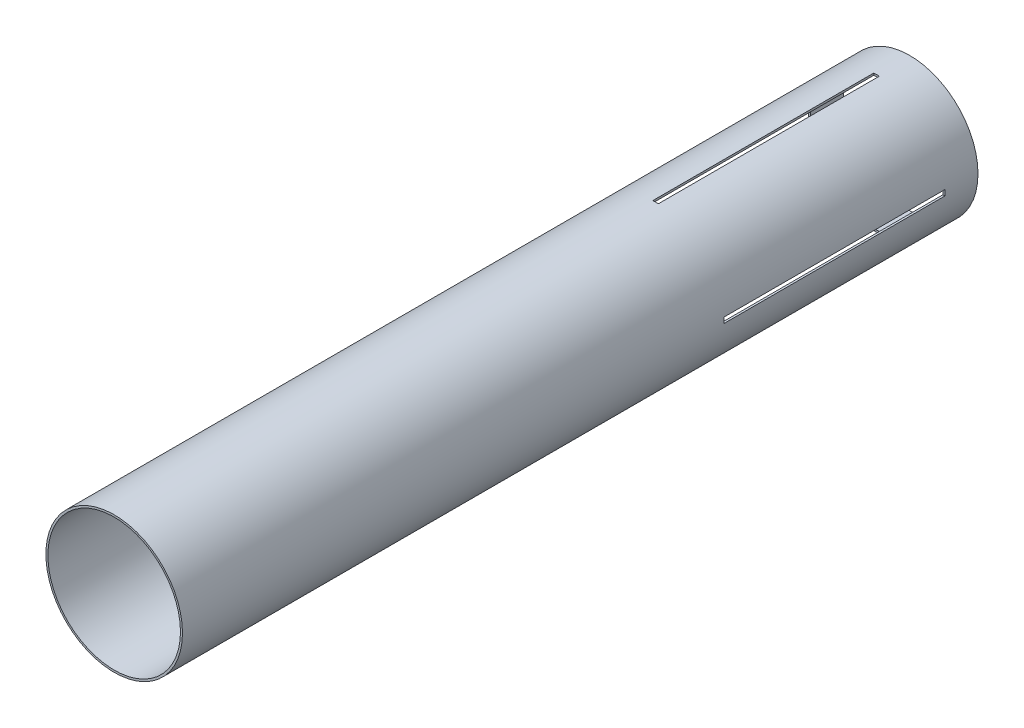
ISO-10303-21;
HEADER;
FILE_DESCRIPTION(('STEP AP214'),'2;1');
FILE_NAME('part.step','',(''),(''),'','','');
FILE_SCHEMA(('AUTOMOTIVE_DESIGN { 1 0 10303 214 1 1 1 1 }'));
ENDSEC;
DATA;
#1=APPLICATION_CONTEXT('core data for automotive mechanical design processes');
#2=APPLICATION_PROTOCOL_DEFINITION('international standard','automotive_design',2000,#1);
#3=PRODUCT_CONTEXT('',#1,'mechanical');
#4=PRODUCT('Part','Part','',(#3));
#5=PRODUCT_RELATED_PRODUCT_CATEGORY('part','',(#4));
#6=PRODUCT_DEFINITION_FORMATION('','',#4);
#7=PRODUCT_DEFINITION_CONTEXT('part definition',#1,'design');
#8=PRODUCT_DEFINITION('design','',#6,#7);
#9=PRODUCT_DEFINITION_SHAPE('','',#8);
#10=(LENGTH_UNIT() NAMED_UNIT(*) SI_UNIT(.MILLI.,.METRE.));
#11=(NAMED_UNIT(*) PLANE_ANGLE_UNIT() SI_UNIT($,.RADIAN.));
#12=(NAMED_UNIT(*) SI_UNIT($,.STERADIAN.) SOLID_ANGLE_UNIT());
#13=UNCERTAINTY_MEASURE_WITH_UNIT(LENGTH_MEASURE(1.E-05),#10,'distance_accuracy_value','');
#14=(GEOMETRIC_REPRESENTATION_CONTEXT(3) GLOBAL_UNCERTAINTY_ASSIGNED_CONTEXT((#13)) GLOBAL_UNIT_ASSIGNED_CONTEXT((#10,
#11,#12)) REPRESENTATION_CONTEXT('',''));
#15=CARTESIAN_POINT('',(0.,0.,0.));
#16=DIRECTION('',(0.,0.,1.));
#17=DIRECTION('',(1.,0.,0.));
#18=AXIS2_PLACEMENT_3D('',#15,#16,#17);
#19=CARTESIAN_POINT('',(0.,0.,228.6));
#20=DIRECTION('',(0.,0.,-1.));
#21=DIRECTION('',(-1.,0.,0.));
#22=AXIS2_PLACEMENT_3D('',#19,#20,#21);
#23=CYLINDRICAL_SURFACE('',#22,39.2557);
#24=CARTESIAN_POINT('',(0.,0.,-82.55));
#25=DIRECTION('',(0.,0.,-1.));
#26=DIRECTION('',(-1.,0.,0.));
#27=AXIS2_PLACEMENT_3D('',#24,#25,#26);
#28=CIRCLE('',#27,39.2557);
#29=CARTESIAN_POINT('',(-39.2235876258152,-1.58750000000014,-82.55));
#30=VERTEX_POINT('',#29);
#31=CARTESIAN_POINT('',(-39.2235876258152,1.58749999999986,-82.55));
#32=VERTEX_POINT('',#31);
#33=EDGE_CURVE('E210',#30,#32,#28,.T.);
#34=ORIENTED_EDGE('',*,*,#33,.F.);
#35=DIRECTION('',(0.,0.,-1.));
#36=VECTOR('',#35,1.);
#37=CARTESIAN_POINT('',(-39.2235876258152,-1.58750000000014,228.6));
#38=LINE('',#37,#36);
#39=CARTESIAN_POINT('',(-39.2235876258152,-1.58750000000014,-209.55));
#40=VERTEX_POINT('',#39);
#41=EDGE_CURVE('E233',#40,#30,#38,.F.);
#42=ORIENTED_EDGE('',*,*,#41,.F.);
#43=CARTESIAN_POINT('',(0.,0.,-209.55));
#44=DIRECTION('',(0.,0.,1.));
#45=DIRECTION('',(1.,0.,0.));
#46=AXIS2_PLACEMENT_3D('',#43,#44,#45);
#47=CIRCLE('',#46,39.2557);
#48=CARTESIAN_POINT('',(-39.2235876258152,1.58749999999986,-209.55));
#49=VERTEX_POINT('',#48);
#50=EDGE_CURVE('E226',#49,#40,#47,.T.);
#51=ORIENTED_EDGE('',*,*,#50,.F.);
#52=DIRECTION('',(0.,0.,-1.));
#53=VECTOR('',#52,1.);
#54=CARTESIAN_POINT('',(-39.2235876258152,1.58749999999986,228.6));
#55=LINE('',#54,#53);
#56=EDGE_CURVE('E230',#32,#49,#55,.T.);
#57=ORIENTED_EDGE('',*,*,#56,.F.);
#58=EDGE_LOOP('',(#34,#42,#51,#57));
#59=FACE_BOUND('',#58,.T.);
#60=CARTESIAN_POINT('',(1.5875,-39.2235876258152,-82.55));
#61=VERTEX_POINT('',#60);
#62=CARTESIAN_POINT('',(-1.5875,-39.2235876258152,-82.55));
#63=VERTEX_POINT('',#62);
#64=EDGE_CURVE('E234',#61,#63,#28,.T.);
#65=ORIENTED_EDGE('',*,*,#64,.F.);
#66=DIRECTION('',(0.,0.,-1.));
#67=VECTOR('',#66,1.);
#68=CARTESIAN_POINT('',(1.5875,-39.2235876258152,228.6));
#69=LINE('',#68,#67);
#70=CARTESIAN_POINT('',(1.5875,-39.2235876258152,-209.55));
#71=VERTEX_POINT('',#70);
#72=EDGE_CURVE('E221',#71,#61,#69,.F.);
#73=ORIENTED_EDGE('',*,*,#72,.F.);
#74=CARTESIAN_POINT('',(-1.5875,-39.2235876258152,-209.55));
#75=VERTEX_POINT('',#74);
#76=EDGE_CURVE('E53',#75,#71,#47,.T.);
#77=ORIENTED_EDGE('',*,*,#76,.F.);
#78=DIRECTION('',(0.,0.,-1.));
#79=VECTOR('',#78,1.);
#80=CARTESIAN_POINT('',(-1.5875,-39.2235876258152,228.6));
#81=LINE('',#80,#79);
#82=EDGE_CURVE('E223',#63,#75,#81,.T.);
#83=ORIENTED_EDGE('',*,*,#82,.F.);
#84=EDGE_LOOP('',(#65,#73,#77,#83));
#85=FACE_BOUND('',#84,.T.);
#86=CARTESIAN_POINT('',(0.,0.,228.6));
#87=DIRECTION('',(0.,0.,1.));
#88=DIRECTION('',(1.,0.,0.));
#89=AXIS2_PLACEMENT_3D('',#86,#87,#88);
#90=CIRCLE('',#89,39.2557);
#91=CARTESIAN_POINT('',(39.2557,0.,228.6));
#92=VERTEX_POINT('',#91);
#93=EDGE_CURVE('E263',#92,#92,#90,.T.);
#94=ORIENTED_EDGE('',*,*,#93,.F.);
#95=EDGE_LOOP('',(#94));
#96=FACE_BOUND('',#95,.T.);
#97=CARTESIAN_POINT('',(0.,0.,-228.6));
#98=DIRECTION('',(0.,0.,1.));
#99=DIRECTION('',(1.,0.,0.));
#100=AXIS2_PLACEMENT_3D('',#97,#98,#99);
#101=CIRCLE('',#100,39.2557);
#102=CARTESIAN_POINT('',(39.2557,0.,-228.6));
#103=VERTEX_POINT('',#102);
#104=EDGE_CURVE('E260',#103,#103,#101,.T.);
#105=ORIENTED_EDGE('',*,*,#104,.T.);
#106=EDGE_LOOP('',(#105));
#107=FACE_BOUND('',#106,.T.);
#108=CARTESIAN_POINT('',(0.,0.,-209.55));
#109=DIRECTION('',(0.,0.,1.));
#110=DIRECTION('',(1.,0.,0.));
#111=AXIS2_PLACEMENT_3D('',#108,#109,#110);
#112=CIRCLE('',#111,39.2557);
#113=CARTESIAN_POINT('',(1.5875,39.2235876258152,-209.55));
#114=VERTEX_POINT('',#113);
#115=CARTESIAN_POINT('',(-1.5875,39.2235876258152,-209.55));
#116=VERTEX_POINT('',#115);
#117=EDGE_CURVE('E248',#114,#116,#112,.T.);
#118=ORIENTED_EDGE('',*,*,#117,.F.);
#119=DIRECTION('',(0.,0.,-1.));
#120=VECTOR('',#119,1.);
#121=CARTESIAN_POINT('',(1.5875,39.2235876258152,228.6));
#122=LINE('',#121,#120);
#123=CARTESIAN_POINT('',(1.5875,39.2235876258152,-82.55));
#124=VERTEX_POINT('',#123);
#125=EDGE_CURVE('E250',#124,#114,#122,.T.);
#126=ORIENTED_EDGE('',*,*,#125,.F.);
#127=CARTESIAN_POINT('',(0.,0.,-82.55));
#128=DIRECTION('',(0.,0.,-1.));
#129=DIRECTION('',(-1.,0.,0.));
#130=AXIS2_PLACEMENT_3D('',#127,#128,#129);
#131=CIRCLE('',#130,39.2557);
#132=CARTESIAN_POINT('',(-1.5875,39.2235876258152,-82.55));
#133=VERTEX_POINT('',#132);
#134=EDGE_CURVE('E252',#133,#124,#131,.T.);
#135=ORIENTED_EDGE('',*,*,#134,.F.);
#136=DIRECTION('',(0.,0.,-1.));
#137=VECTOR('',#136,1.);
#138=CARTESIAN_POINT('',(-1.5875,39.2235876258152,228.6));
#139=LINE('',#138,#137);
#140=EDGE_CURVE('E254',#116,#133,#139,.F.);
#141=ORIENTED_EDGE('',*,*,#140,.F.);
#142=EDGE_LOOP('',(#118,#126,#135,#141));
#143=FACE_BOUND('',#142,.T.);
#144=CARTESIAN_POINT('',(39.2235876258151,1.58750000000014,-82.55));
#145=VERTEX_POINT('',#144);
#146=CARTESIAN_POINT('',(39.2235876258152,-1.58749999999959,-82.55));
#147=VERTEX_POINT('',#146);
#148=EDGE_CURVE('E61',#145,#147,#28,.T.);
#149=ORIENTED_EDGE('',*,*,#148,.F.);
#150=DIRECTION('',(0.,0.,-1.));
#151=VECTOR('',#150,1.);
#152=CARTESIAN_POINT('',(39.2235876258152,1.58750000000014,228.6));
#153=LINE('',#152,#151);
#154=CARTESIAN_POINT('',(39.2235876258152,1.58750000000014,-209.55));
#155=VERTEX_POINT('',#154);
#156=EDGE_CURVE('E228',#155,#145,#153,.F.);
#157=ORIENTED_EDGE('',*,*,#156,.F.);
#158=CARTESIAN_POINT('',(39.2235876258152,-1.58749999999959,-209.55));
#159=VERTEX_POINT('',#158);
#160=EDGE_CURVE('E225',#159,#155,#47,.T.);
#161=ORIENTED_EDGE('',*,*,#160,.F.);
#162=DIRECTION('',(0.,0.,-1.));
#163=VECTOR('',#162,1.);
#164=CARTESIAN_POINT('',(39.2235876258152,-1.58749999999959,228.6));
#165=LINE('',#164,#163);
#166=EDGE_CURVE('E214',#147,#159,#165,.T.);
#167=ORIENTED_EDGE('',*,*,#166,.F.);
#168=EDGE_LOOP('',(#149,#157,#161,#167));
#169=FACE_BOUND('',#168,.T.);
#170=ADVANCED_FACE('F39',(#59,#85,#96,#107,#143,#169),#23,.T.);
#171=CARTESIAN_POINT('',(0.,0.,228.6));
#172=DIRECTION('',(0.,0.,-1.));
#173=DIRECTION('',(-1.,0.,0.));
#174=AXIS2_PLACEMENT_3D('',#171,#172,#173);
#175=CYLINDRICAL_SURFACE('',#174,38.1);
#176=CARTESIAN_POINT('',(0.,0.,228.6));
#177=DIRECTION('',(0.,0.,1.));
#178=DIRECTION('',(1.,0.,0.));
#179=AXIS2_PLACEMENT_3D('',#176,#177,#178);
#180=CIRCLE('',#179,38.1);
#181=CARTESIAN_POINT('',(38.1,0.,228.6));
#182=VERTEX_POINT('',#181);
#183=EDGE_CURVE('E257',#182,#182,#180,.T.);
#184=ORIENTED_EDGE('',*,*,#183,.T.);
#185=EDGE_LOOP('',(#184));
#186=FACE_BOUND('',#185,.T.);
#187=CARTESIAN_POINT('',(0.,0.,-228.6));
#188=DIRECTION('',(0.,0.,1.));
#189=DIRECTION('',(1.,0.,0.));
#190=AXIS2_PLACEMENT_3D('',#187,#188,#189);
#191=CIRCLE('',#190,38.1);
#192=CARTESIAN_POINT('',(38.1,0.,-228.6));
#193=VERTEX_POINT('',#192);
#194=EDGE_CURVE('E256',#193,#193,#191,.T.);
#195=ORIENTED_EDGE('',*,*,#194,.F.);
#196=EDGE_LOOP('',(#195));
#197=FACE_BOUND('',#196,.T.);
#198=CARTESIAN_POINT('',(0.,0.,-209.55));
#199=DIRECTION('',(0.,0.,1.));
#200=DIRECTION('',(1.,0.,0.));
#201=AXIS2_PLACEMENT_3D('',#198,#199,#200);
#202=CIRCLE('',#201,38.1);
#203=CARTESIAN_POINT('',(1.5875,38.0669127162947,-209.55));
#204=VERTEX_POINT('',#203);
#205=CARTESIAN_POINT('',(-1.5875,38.0669127162947,-209.55));
#206=VERTEX_POINT('',#205);
#207=EDGE_CURVE('E266',#204,#206,#202,.T.);
#208=ORIENTED_EDGE('',*,*,#207,.T.);
#209=DIRECTION('',(0.,0.,-1.));
#210=VECTOR('',#209,1.);
#211=CARTESIAN_POINT('',(-1.5875,38.0669127162947,228.6));
#212=LINE('',#211,#210);
#213=CARTESIAN_POINT('',(-1.5875,38.0669127162947,-82.55));
#214=VERTEX_POINT('',#213);
#215=EDGE_CURVE('E166',#206,#214,#212,.F.);
#216=ORIENTED_EDGE('',*,*,#215,.T.);
#217=CARTESIAN_POINT('',(0.,0.,-82.55));
#218=DIRECTION('',(0.,0.,-1.));
#219=DIRECTION('',(-1.,0.,0.));
#220=AXIS2_PLACEMENT_3D('',#217,#218,#219);
#221=CIRCLE('',#220,38.1);
#222=CARTESIAN_POINT('',(1.5875,38.0669127162947,-82.55));
#223=VERTEX_POINT('',#222);
#224=EDGE_CURVE('E274',#214,#223,#221,.T.);
#225=ORIENTED_EDGE('',*,*,#224,.T.);
#226=DIRECTION('',(0.,0.,-1.));
#227=VECTOR('',#226,1.);
#228=CARTESIAN_POINT('',(1.5875,38.0669127162947,228.6));
#229=LINE('',#228,#227);
#230=EDGE_CURVE('E271',#223,#204,#229,.T.);
#231=ORIENTED_EDGE('',*,*,#230,.T.);
#232=EDGE_LOOP('',(#208,#216,#225,#231));
#233=FACE_BOUND('',#232,.T.);
#234=DIRECTION('',(0.,0.,-1.));
#235=VECTOR('',#234,1.);
#236=CARTESIAN_POINT('',(38.0669127162947,1.58750000000013,228.6));
#237=LINE('',#236,#235);
#238=CARTESIAN_POINT('',(38.0669127162947,1.58750000000013,-209.55));
#239=VERTEX_POINT('',#238);
#240=CARTESIAN_POINT('',(38.0669127162947,1.58750000000013,-82.55));
#241=VERTEX_POINT('',#240);
#242=EDGE_CURVE('E176',#239,#241,#237,.F.);
#243=ORIENTED_EDGE('',*,*,#242,.T.);
#244=CARTESIAN_POINT('',(0.,0.,-82.55));
#245=DIRECTION('',(0.,0.,-1.));
#246=DIRECTION('',(-1.,0.,0.));
#247=AXIS2_PLACEMENT_3D('',#244,#245,#246);
#248=CIRCLE('',#247,38.1);
#249=CARTESIAN_POINT('',(38.0669127162947,-1.5874999999996,-82.55));
#250=VERTEX_POINT('',#249);
#251=EDGE_CURVE('E169',#241,#250,#248,.T.);
#252=ORIENTED_EDGE('',*,*,#251,.T.);
#253=DIRECTION('',(0.,0.,-1.));
#254=VECTOR('',#253,1.);
#255=CARTESIAN_POINT('',(38.0669127162947,-1.5874999999996,228.6));
#256=LINE('',#255,#254);
#257=CARTESIAN_POINT('',(38.0669127162947,-1.5874999999996,-209.55));
#258=VERTEX_POINT('',#257);
#259=EDGE_CURVE('E154',#250,#258,#256,.T.);
#260=ORIENTED_EDGE('',*,*,#259,.T.);
#261=CARTESIAN_POINT('',(0.,0.,-209.55));
#262=DIRECTION('',(0.,0.,1.));
#263=DIRECTION('',(1.,0.,0.));
#264=AXIS2_PLACEMENT_3D('',#261,#262,#263);
#265=CIRCLE('',#264,38.1);
#266=EDGE_CURVE('E165',#258,#239,#265,.T.);
#267=ORIENTED_EDGE('',*,*,#266,.T.);
#268=EDGE_LOOP('',(#243,#252,#260,#267));
#269=FACE_BOUND('',#268,.T.);
#270=CARTESIAN_POINT('',(1.5875,-38.0669127162947,-82.55));
#271=VERTEX_POINT('',#270);
#272=CARTESIAN_POINT('',(-1.5875,-38.0669127162947,-82.55));
#273=VERTEX_POINT('',#272);
#274=EDGE_CURVE('E179',#271,#273,#248,.T.);
#275=ORIENTED_EDGE('',*,*,#274,.T.);
#276=DIRECTION('',(0.,0.,-1.));
#277=VECTOR('',#276,1.);
#278=CARTESIAN_POINT('',(-1.5875,-38.0669127162947,228.6));
#279=LINE('',#278,#277);
#280=CARTESIAN_POINT('',(-1.5875,-38.0669127162947,-209.55));
#281=VERTEX_POINT('',#280);
#282=EDGE_CURVE('E187',#273,#281,#279,.T.);
#283=ORIENTED_EDGE('',*,*,#282,.T.);
#284=CARTESIAN_POINT('',(1.5875,-38.0669127162947,-209.55));
#285=VERTEX_POINT('',#284);
#286=EDGE_CURVE('E181',#281,#285,#265,.T.);
#287=ORIENTED_EDGE('',*,*,#286,.T.);
#288=DIRECTION('',(0.,0.,-1.));
#289=VECTOR('',#288,1.);
#290=CARTESIAN_POINT('',(1.5875,-38.0669127162947,228.6));
#291=LINE('',#290,#289);
#292=EDGE_CURVE('E177',#285,#271,#291,.F.);
#293=ORIENTED_EDGE('',*,*,#292,.T.);
#294=EDGE_LOOP('',(#275,#283,#287,#293));
#295=FACE_BOUND('',#294,.T.);
#296=CARTESIAN_POINT('',(-38.0669127162947,1.58749999999987,-209.55));
#297=VERTEX_POINT('',#296);
#298=CARTESIAN_POINT('',(-38.0669127162947,-1.58750000000013,-209.55));
#299=VERTEX_POINT('',#298);
#300=EDGE_CURVE('E190',#297,#299,#265,.T.);
#301=ORIENTED_EDGE('',*,*,#300,.T.);
#302=DIRECTION('',(0.,0.,-1.));
#303=VECTOR('',#302,1.);
#304=CARTESIAN_POINT('',(-38.0669127162947,-1.58750000000013,228.6));
#305=LINE('',#304,#303);
#306=CARTESIAN_POINT('',(-38.0669127162947,-1.58750000000013,-82.55));
#307=VERTEX_POINT('',#306);
#308=EDGE_CURVE('E11',#299,#307,#305,.F.);
#309=ORIENTED_EDGE('',*,*,#308,.T.);
#310=CARTESIAN_POINT('',(-38.0669127162947,1.58749999999987,-82.55));
#311=VERTEX_POINT('',#310);
#312=EDGE_CURVE('E46',#307,#311,#248,.T.);
#313=ORIENTED_EDGE('',*,*,#312,.T.);
#314=DIRECTION('',(0.,0.,-1.));
#315=VECTOR('',#314,1.);
#316=CARTESIAN_POINT('',(-38.0669127162947,1.58749999999987,228.6));
#317=LINE('',#316,#315);
#318=EDGE_CURVE('E185',#311,#297,#317,.T.);
#319=ORIENTED_EDGE('',*,*,#318,.T.);
#320=EDGE_LOOP('',(#301,#309,#313,#319));
#321=FACE_BOUND('',#320,.T.);
#322=ADVANCED_FACE('F174',(#186,#197,#233,#269,#295,#321),#175,.F.);
#323=CARTESIAN_POINT('',(0.,0.,228.6));
#324=DIRECTION('',(0.,0.,1.));
#325=DIRECTION('',(1.,0.,0.));
#326=AXIS2_PLACEMENT_3D('',#323,#324,#325);
#327=PLANE('',#326);
#328=ORIENTED_EDGE('',*,*,#93,.T.);
#329=EDGE_LOOP('',(#328));
#330=FACE_BOUND('',#329,.T.);
#331=ORIENTED_EDGE('',*,*,#183,.F.);
#332=EDGE_LOOP('',(#331));
#333=FACE_BOUND('',#332,.T.);
#334=ADVANCED_FACE('F313',(#330,#333),#327,.T.);
#335=CARTESIAN_POINT('',(0.,0.,-228.6));
#336=DIRECTION('',(0.,0.,1.));
#337=DIRECTION('',(1.,0.,0.));
#338=AXIS2_PLACEMENT_3D('',#335,#336,#337);
#339=PLANE('',#338);
#340=ORIENTED_EDGE('',*,*,#104,.F.);
#341=EDGE_LOOP('',(#340));
#342=FACE_BOUND('',#341,.T.);
#343=ORIENTED_EDGE('',*,*,#194,.T.);
#344=EDGE_LOOP('',(#343));
#345=FACE_BOUND('',#344,.T.);
#346=ADVANCED_FACE('F326',(#342,#345),#339,.F.);
#347=CARTESIAN_POINT('',(-1.5875,39.2557,-82.55));
#348=DIRECTION('',(1.,0.,0.));
#349=DIRECTION('',(0.,0.,-1.));
#350=AXIS2_PLACEMENT_3D('',#347,#348,#349);
#351=PLANE('',#350);
#352=ORIENTED_EDGE('',*,*,#140,.T.);
#353=DIRECTION('',(0.,-1.,0.));
#354=VECTOR('',#353,1.);
#355=CARTESIAN_POINT('',(-1.5875,39.2557,-82.55));
#356=LINE('',#355,#354);
#357=EDGE_CURVE('E245',#133,#214,#356,.T.);
#358=ORIENTED_EDGE('',*,*,#357,.T.);
#359=ORIENTED_EDGE('',*,*,#215,.F.);
#360=DIRECTION('',(0.,-1.,0.));
#361=VECTOR('',#360,1.);
#362=CARTESIAN_POINT('',(-1.5875,39.2557,-209.55));
#363=LINE('',#362,#361);
#364=EDGE_CURVE('E237',#116,#206,#363,.T.);
#365=ORIENTED_EDGE('',*,*,#364,.F.);
#366=EDGE_LOOP('',(#352,#358,#359,#365));
#367=FACE_BOUND('',#366,.T.);
#368=ADVANCED_FACE('F282',(#367),#351,.T.);
#369=CARTESIAN_POINT('',(1.5875,39.2557,-82.55));
#370=DIRECTION('',(0.,0.,-1.));
#371=DIRECTION('',(-1.,0.,0.));
#372=AXIS2_PLACEMENT_3D('',#369,#370,#371);
#373=PLANE('',#372);
#374=ORIENTED_EDGE('',*,*,#134,.T.);
#375=DIRECTION('',(0.,-1.,0.));
#376=VECTOR('',#375,1.);
#377=CARTESIAN_POINT('',(1.5875,39.2557,-82.55));
#378=LINE('',#377,#376);
#379=EDGE_CURVE('E242',#124,#223,#378,.T.);
#380=ORIENTED_EDGE('',*,*,#379,.T.);
#381=ORIENTED_EDGE('',*,*,#224,.F.);
#382=ORIENTED_EDGE('',*,*,#357,.F.);
#383=EDGE_LOOP('',(#374,#380,#381,#382));
#384=FACE_BOUND('',#383,.T.);
#385=ADVANCED_FACE('F287',(#384),#373,.T.);
#386=CARTESIAN_POINT('',(1.5875,39.2557,-82.55));
#387=DIRECTION('',(-1.,0.,0.));
#388=DIRECTION('',(0.,0.,1.));
#389=AXIS2_PLACEMENT_3D('',#386,#387,#388);
#390=PLANE('',#389);
#391=ORIENTED_EDGE('',*,*,#125,.T.);
#392=DIRECTION('',(0.,-1.,0.));
#393=VECTOR('',#392,1.);
#394=CARTESIAN_POINT('',(1.5875,39.2557,-209.55));
#395=LINE('',#394,#393);
#396=EDGE_CURVE('E239',#114,#204,#395,.T.);
#397=ORIENTED_EDGE('',*,*,#396,.T.);
#398=ORIENTED_EDGE('',*,*,#230,.F.);
#399=ORIENTED_EDGE('',*,*,#379,.F.);
#400=EDGE_LOOP('',(#391,#397,#398,#399));
#401=FACE_BOUND('',#400,.T.);
#402=ADVANCED_FACE('F295',(#401),#390,.T.);
#403=CARTESIAN_POINT('',(1.5875,39.2557,-209.55));
#404=DIRECTION('',(0.,0.,1.));
#405=DIRECTION('',(1.,0.,0.));
#406=AXIS2_PLACEMENT_3D('',#403,#404,#405);
#407=PLANE('',#406);
#408=ORIENTED_EDGE('',*,*,#117,.T.);
#409=ORIENTED_EDGE('',*,*,#364,.T.);
#410=ORIENTED_EDGE('',*,*,#207,.F.);
#411=ORIENTED_EDGE('',*,*,#396,.F.);
#412=EDGE_LOOP('',(#408,#409,#410,#411));
#413=FACE_BOUND('',#412,.T.);
#414=ADVANCED_FACE('F297',(#413),#407,.T.);
#415=CARTESIAN_POINT('',(39.2557000000004,-1.58749999999959,-82.55));
#416=DIRECTION('',(0.,1.,0.));
#417=DIRECTION('',(-1.,0.,0.));
#418=AXIS2_PLACEMENT_3D('',#415,#416,#417);
#419=PLANE('',#418);
#420=ORIENTED_EDGE('',*,*,#166,.T.);
#421=DIRECTION('',(-1.,0.,0.));
#422=VECTOR('',#421,1.);
#423=CARTESIAN_POINT('',(39.2557000000004,-1.58749999999959,-209.55));
#424=LINE('',#423,#422);
#425=EDGE_CURVE('E160',#159,#258,#424,.T.);
#426=ORIENTED_EDGE('',*,*,#425,.T.);
#427=ORIENTED_EDGE('',*,*,#259,.F.);
#428=DIRECTION('',(-1.,0.,0.));
#429=VECTOR('',#428,1.);
#430=CARTESIAN_POINT('',(39.2557000000004,-1.58749999999959,-82.55));
#431=LINE('',#430,#429);
#432=EDGE_CURVE('E157',#147,#250,#431,.T.);
#433=ORIENTED_EDGE('',*,*,#432,.F.);
#434=EDGE_LOOP('',(#420,#426,#427,#433));
#435=FACE_BOUND('',#434,.T.);
#436=ADVANCED_FACE('F156',(#435),#419,.T.);
#437=CARTESIAN_POINT('',(-39.2557000000002,1.58749999999986,-209.55));
#438=DIRECTION('',(0.,0.,1.));
#439=DIRECTION('',(1.,0.,0.));
#440=AXIS2_PLACEMENT_3D('',#437,#438,#439);
#441=PLANE('',#440);
#442=ORIENTED_EDGE('',*,*,#160,.T.);
#443=DIRECTION('',(1.,0.,0.));
#444=VECTOR('',#443,1.);
#445=CARTESIAN_POINT('',(-39.2557000000002,1.58749999999986,-209.55));
#446=LINE('',#445,#444);
#447=EDGE_CURVE('E217',#239,#155,#446,.T.);
#448=ORIENTED_EDGE('',*,*,#447,.F.);
#449=ORIENTED_EDGE('',*,*,#266,.F.);
#450=ORIENTED_EDGE('',*,*,#425,.F.);
#451=EDGE_LOOP('',(#442,#448,#449,#450));
#452=FACE_BOUND('',#451,.T.);
#453=ADVANCED_FACE('F305',(#452),#441,.T.);
#454=CARTESIAN_POINT('',(-39.2557000000002,1.58749999999986,-82.55));
#455=DIRECTION('',(0.,-1.,0.));
#456=DIRECTION('',(1.,0.,0.));
#457=AXIS2_PLACEMENT_3D('',#454,#455,#456);
#458=PLANE('',#457);
#459=ORIENTED_EDGE('',*,*,#156,.T.);
#460=DIRECTION('',(1.,0.,0.));
#461=VECTOR('',#460,1.);
#462=CARTESIAN_POINT('',(-39.2557000000002,1.58749999999986,-82.55));
#463=LINE('',#462,#461);
#464=EDGE_CURVE('E212',#241,#145,#463,.T.);
#465=ORIENTED_EDGE('',*,*,#464,.F.);
#466=ORIENTED_EDGE('',*,*,#242,.F.);
#467=ORIENTED_EDGE('',*,*,#447,.T.);
#468=EDGE_LOOP('',(#459,#465,#466,#467));
#469=FACE_BOUND('',#468,.T.);
#470=ADVANCED_FACE('F379',(#469),#458,.T.);
#471=CARTESIAN_POINT('',(-39.2557000000002,1.58749999999986,-82.55));
#472=DIRECTION('',(0.,0.,-1.));
#473=DIRECTION('',(-1.,0.,0.));
#474=AXIS2_PLACEMENT_3D('',#471,#472,#473);
#475=PLANE('',#474);
#476=ORIENTED_EDGE('',*,*,#148,.T.);
#477=ORIENTED_EDGE('',*,*,#432,.T.);
#478=ORIENTED_EDGE('',*,*,#251,.F.);
#479=ORIENTED_EDGE('',*,*,#464,.T.);
#480=EDGE_LOOP('',(#476,#477,#478,#479));
#481=FACE_BOUND('',#480,.T.);
#482=ADVANCED_FACE('F168',(#481),#475,.T.);
#483=CARTESIAN_POINT('',(1.5875,-39.2557,-82.55));
#484=DIRECTION('',(-1.,0.,0.));
#485=DIRECTION('',(0.,0.,1.));
#486=AXIS2_PLACEMENT_3D('',#483,#484,#485);
#487=PLANE('',#486);
#488=ORIENTED_EDGE('',*,*,#72,.T.);
#489=DIRECTION('',(0.,1.,0.));
#490=VECTOR('',#489,1.);
#491=CARTESIAN_POINT('',(1.5875,-39.2557,-82.55));
#492=LINE('',#491,#490);
#493=EDGE_CURVE('E515',#61,#271,#492,.T.);
#494=ORIENTED_EDGE('',*,*,#493,.T.);
#495=ORIENTED_EDGE('',*,*,#292,.F.);
#496=DIRECTION('',(0.,1.,0.));
#497=VECTOR('',#496,1.);
#498=CARTESIAN_POINT('',(1.5875,-39.2557,-209.55));
#499=LINE('',#498,#497);
#500=EDGE_CURVE('E171',#71,#285,#499,.T.);
#501=ORIENTED_EDGE('',*,*,#500,.F.);
#502=EDGE_LOOP('',(#488,#494,#495,#501));
#503=FACE_BOUND('',#502,.T.);
#504=ADVANCED_FACE('F409',(#503),#487,.T.);
#505=CARTESIAN_POINT('',(-1.5875,-39.2557,-82.55));
#506=DIRECTION('',(1.,0.,0.));
#507=DIRECTION('',(0.,0.,-1.));
#508=AXIS2_PLACEMENT_3D('',#505,#506,#507);
#509=PLANE('',#508);
#510=ORIENTED_EDGE('',*,*,#82,.T.);
#511=DIRECTION('',(0.,1.,0.));
#512=VECTOR('',#511,1.);
#513=CARTESIAN_POINT('',(-1.5875,-39.2557,-209.55));
#514=LINE('',#513,#512);
#515=EDGE_CURVE('E522',#75,#281,#514,.T.);
#516=ORIENTED_EDGE('',*,*,#515,.T.);
#517=ORIENTED_EDGE('',*,*,#282,.F.);
#518=DIRECTION('',(0.,1.,0.));
#519=VECTOR('',#518,1.);
#520=CARTESIAN_POINT('',(-1.5875,-39.2557,-82.55));
#521=LINE('',#520,#519);
#522=EDGE_CURVE('E517',#63,#273,#521,.T.);
#523=ORIENTED_EDGE('',*,*,#522,.F.);
#524=EDGE_LOOP('',(#510,#516,#517,#523));
#525=FACE_BOUND('',#524,.T.);
#526=ADVANCED_FACE('F425',(#525),#509,.T.);
#527=ORIENTED_EDGE('',*,*,#76,.T.);
#528=ORIENTED_EDGE('',*,*,#500,.T.);
#529=ORIENTED_EDGE('',*,*,#286,.F.);
#530=ORIENTED_EDGE('',*,*,#515,.F.);
#531=EDGE_LOOP('',(#527,#528,#529,#530));
#532=FACE_BOUND('',#531,.T.);
#533=ADVANCED_FACE('F383',(#532),#441,.T.);
#534=ORIENTED_EDGE('',*,*,#64,.T.);
#535=ORIENTED_EDGE('',*,*,#522,.T.);
#536=ORIENTED_EDGE('',*,*,#274,.F.);
#537=ORIENTED_EDGE('',*,*,#493,.F.);
#538=EDGE_LOOP('',(#534,#535,#536,#537));
#539=FACE_BOUND('',#538,.T.);
#540=ADVANCED_FACE('F411',(#539),#475,.T.);
#541=CARTESIAN_POINT('',(-39.2557000000001,-1.58750000000014,-82.55));
#542=DIRECTION('',(0.,1.,0.));
#543=DIRECTION('',(-1.,0.,0.));
#544=AXIS2_PLACEMENT_3D('',#541,#542,#543);
#545=PLANE('',#544);
#546=ORIENTED_EDGE('',*,*,#41,.T.);
#547=DIRECTION('',(1.,0.,0.));
#548=VECTOR('',#547,1.);
#549=CARTESIAN_POINT('',(-39.2557000000001,-1.58750000000014,-82.55));
#550=LINE('',#549,#548);
#551=EDGE_CURVE('E211',#30,#307,#550,.T.);
#552=ORIENTED_EDGE('',*,*,#551,.T.);
#553=ORIENTED_EDGE('',*,*,#308,.F.);
#554=DIRECTION('',(1.,0.,0.));
#555=VECTOR('',#554,1.);
#556=CARTESIAN_POINT('',(-39.2557000000001,-1.58750000000014,-209.55));
#557=LINE('',#556,#555);
#558=EDGE_CURVE('E513',#40,#299,#557,.T.);
#559=ORIENTED_EDGE('',*,*,#558,.F.);
#560=EDGE_LOOP('',(#546,#552,#553,#559));
#561=FACE_BOUND('',#560,.T.);
#562=ADVANCED_FACE('F457',(#561),#545,.T.);
#563=ORIENTED_EDGE('',*,*,#33,.T.);
#564=EDGE_CURVE('E202',#32,#311,#463,.T.);
#565=ORIENTED_EDGE('',*,*,#564,.T.);
#566=ORIENTED_EDGE('',*,*,#312,.F.);
#567=ORIENTED_EDGE('',*,*,#551,.F.);
#568=EDGE_LOOP('',(#563,#565,#566,#567));
#569=FACE_BOUND('',#568,.T.);
#570=ADVANCED_FACE('F207',(#569),#475,.T.);
#571=ORIENTED_EDGE('',*,*,#56,.T.);
#572=EDGE_CURVE('E205',#49,#297,#446,.T.);
#573=ORIENTED_EDGE('',*,*,#572,.T.);
#574=ORIENTED_EDGE('',*,*,#318,.F.);
#575=ORIENTED_EDGE('',*,*,#564,.F.);
#576=EDGE_LOOP('',(#571,#573,#574,#575));
#577=FACE_BOUND('',#576,.T.);
#578=ADVANCED_FACE('F201',(#577),#458,.T.);
#579=ORIENTED_EDGE('',*,*,#50,.T.);
#580=ORIENTED_EDGE('',*,*,#558,.T.);
#581=ORIENTED_EDGE('',*,*,#300,.F.);
#582=ORIENTED_EDGE('',*,*,#572,.F.);
#583=EDGE_LOOP('',(#579,#580,#581,#582));
#584=FACE_BOUND('',#583,.T.);
#585=ADVANCED_FACE('F382',(#584),#441,.T.);
#586=CLOSED_SHELL('',(#170,#322,#334,#346,#368,#385,#402,#414,#436,#453,#470,#482,#504,#526,
#533,#540,#562,#570,#578,#585));
#587=MANIFOLD_SOLID_BREP('B2',#586);
#588=ADVANCED_BREP_SHAPE_REPRESENTATION('',(#18,#587),#14);
#589=SHAPE_DEFINITION_REPRESENTATION(#9,#588);
ENDSEC;
END-ISO-10303-21;
